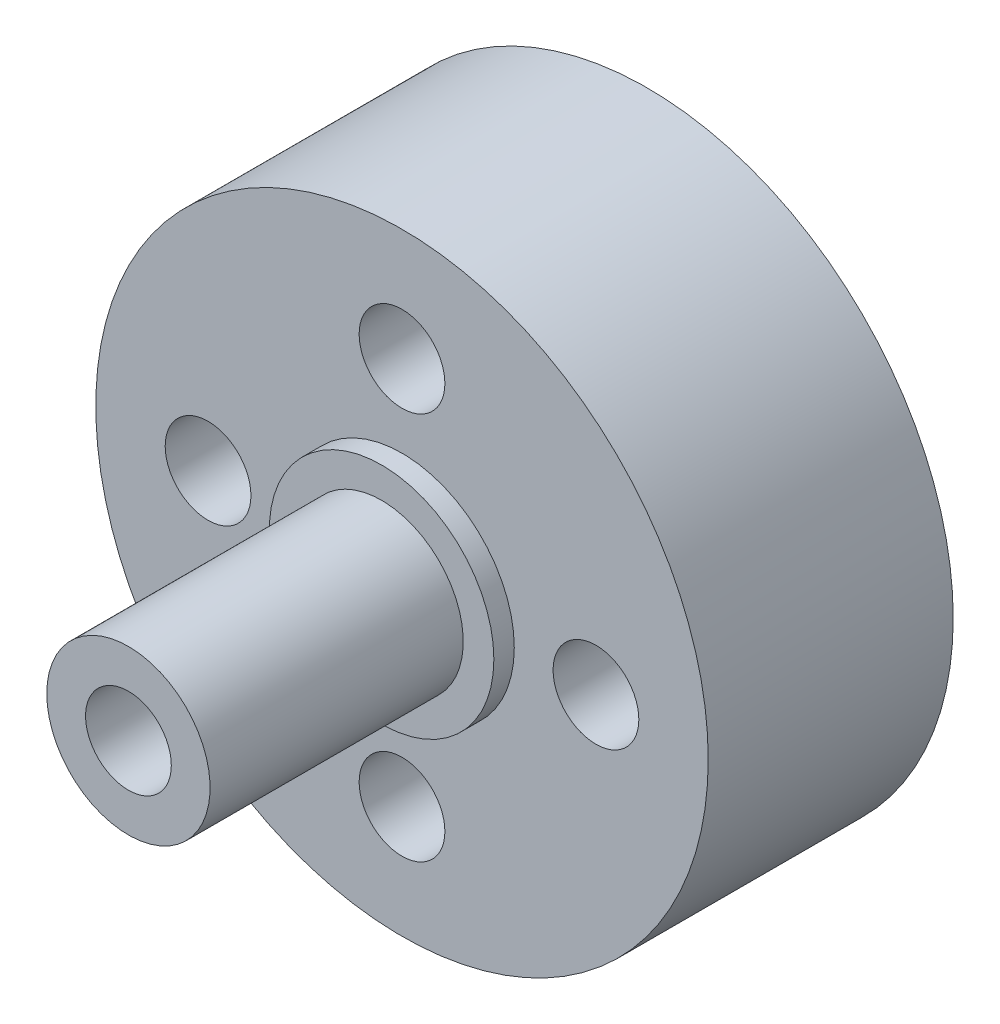
ISO-10303-21;
HEADER;
FILE_DESCRIPTION(('STEP AP214'),'2;1');
FILE_NAME('part.step','',(''),(''),'','','');
FILE_SCHEMA(('AUTOMOTIVE_DESIGN { 1 0 10303 214 1 1 1 1 }'));
ENDSEC;
DATA;
#1=APPLICATION_CONTEXT('core data for automotive mechanical design processes');
#2=APPLICATION_PROTOCOL_DEFINITION('international standard','automotive_design',2000,#1);
#3=PRODUCT_CONTEXT('',#1,'mechanical');
#4=PRODUCT('Part','Part','',(#3));
#5=PRODUCT_RELATED_PRODUCT_CATEGORY('part','',(#4));
#6=PRODUCT_DEFINITION_FORMATION('','',#4);
#7=PRODUCT_DEFINITION_CONTEXT('part definition',#1,'design');
#8=PRODUCT_DEFINITION('design','',#6,#7);
#9=PRODUCT_DEFINITION_SHAPE('','',#8);
#10=(LENGTH_UNIT() NAMED_UNIT(*) SI_UNIT(.MILLI.,.METRE.));
#11=(NAMED_UNIT(*) PLANE_ANGLE_UNIT() SI_UNIT($,.RADIAN.));
#12=(NAMED_UNIT(*) SI_UNIT($,.STERADIAN.) SOLID_ANGLE_UNIT());
#13=UNCERTAINTY_MEASURE_WITH_UNIT(LENGTH_MEASURE(1.E-05),#10,'distance_accuracy_value','');
#14=(GEOMETRIC_REPRESENTATION_CONTEXT(3) GLOBAL_UNCERTAINTY_ASSIGNED_CONTEXT((#13)) GLOBAL_UNIT_ASSIGNED_CONTEXT((#10,
#11,#12)) REPRESENTATION_CONTEXT('',''));
#15=CARTESIAN_POINT('',(0.,0.,0.));
#16=DIRECTION('',(0.,0.,1.));
#17=DIRECTION('',(1.,0.,0.));
#18=AXIS2_PLACEMENT_3D('',#15,#16,#17);
#19=CARTESIAN_POINT('',(0.,0.,13.));
#20=DIRECTION('',(0.,0.,1.));
#21=DIRECTION('',(1.,0.,0.));
#22=AXIS2_PLACEMENT_3D('',#19,#20,#21);
#23=PLANE('',#22);
#24=CARTESIAN_POINT('',(0.,0.,13.));
#25=DIRECTION('',(0.,0.,1.));
#26=DIRECTION('',(1.,0.,0.));
#27=AXIS2_PLACEMENT_3D('',#24,#25,#26);
#28=CIRCLE('',#27,5.5);
#29=CARTESIAN_POINT('',(5.5,0.,13.));
#30=VERTEX_POINT('',#29);
#31=EDGE_CURVE('E94',#30,#30,#28,.T.);
#32=ORIENTED_EDGE('',*,*,#31,.T.);
#33=EDGE_LOOP('',(#32));
#34=FACE_BOUND('',#33,.T.);
#35=CARTESIAN_POINT('',(0.,0.,13.));
#36=DIRECTION('',(0.,0.,1.));
#37=DIRECTION('',(1.,0.,0.));
#38=AXIS2_PLACEMENT_3D('',#35,#36,#37);
#39=CIRCLE('',#38,4.);
#40=CARTESIAN_POINT('',(-4.,0.,13.));
#41=VERTEX_POINT('',#40);
#42=EDGE_CURVE('E87',#41,#41,#39,.T.);
#43=ORIENTED_EDGE('',*,*,#42,.F.);
#44=EDGE_LOOP('',(#43));
#45=FACE_BOUND('',#44,.T.);
#46=ADVANCED_FACE('F38',(#34,#45),#23,.T.);
#47=CARTESIAN_POINT('',(0.,0.,12.));
#48=DIRECTION('',(0.,0.,1.));
#49=DIRECTION('',(1.,0.,0.));
#50=AXIS2_PLACEMENT_3D('',#47,#48,#49);
#51=PLANE('',#50);
#52=CARTESIAN_POINT('',(0.,9.5,12.));
#53=DIRECTION('',(0.,0.,1.));
#54=DIRECTION('',(1.,0.,0.));
#55=AXIS2_PLACEMENT_3D('',#52,#53,#54);
#56=CIRCLE('',#55,2.09999999999999);
#57=CARTESIAN_POINT('',(2.09999999999999,9.5,12.));
#58=VERTEX_POINT('',#57);
#59=EDGE_CURVE('E62',#58,#58,#56,.T.);
#60=ORIENTED_EDGE('',*,*,#59,.F.);
#61=EDGE_LOOP('',(#60));
#62=FACE_BOUND('',#61,.T.);
#63=CARTESIAN_POINT('',(-9.5,0.,12.));
#64=DIRECTION('',(0.,0.,1.));
#65=DIRECTION('',(1.,0.,0.));
#66=AXIS2_PLACEMENT_3D('',#63,#64,#65);
#67=CIRCLE('',#66,2.09999999999999);
#68=CARTESIAN_POINT('',(-7.40000000000001,0.,12.));
#69=VERTEX_POINT('',#68);
#70=EDGE_CURVE('E72',#69,#69,#67,.T.);
#71=ORIENTED_EDGE('',*,*,#70,.F.);
#72=EDGE_LOOP('',(#71));
#73=FACE_BOUND('',#72,.T.);
#74=CARTESIAN_POINT('',(9.5,0.,12.));
#75=DIRECTION('',(0.,0.,1.));
#76=DIRECTION('',(1.,0.,0.));
#77=AXIS2_PLACEMENT_3D('',#74,#75,#76);
#78=CIRCLE('',#77,2.09999999999999);
#79=CARTESIAN_POINT('',(11.6,0.,12.));
#80=VERTEX_POINT('',#79);
#81=EDGE_CURVE('E78',#80,#80,#78,.T.);
#82=ORIENTED_EDGE('',*,*,#81,.F.);
#83=EDGE_LOOP('',(#82));
#84=FACE_BOUND('',#83,.T.);
#85=CARTESIAN_POINT('',(0.,-9.5,12.));
#86=DIRECTION('',(0.,0.,1.));
#87=DIRECTION('',(1.,0.,0.));
#88=AXIS2_PLACEMENT_3D('',#85,#86,#87);
#89=CIRCLE('',#88,2.09999999999999);
#90=CARTESIAN_POINT('',(2.09999999999999,-9.5,12.));
#91=VERTEX_POINT('',#90);
#92=EDGE_CURVE('E84',#91,#91,#89,.T.);
#93=ORIENTED_EDGE('',*,*,#92,.F.);
#94=EDGE_LOOP('',(#93));
#95=FACE_BOUND('',#94,.T.);
#96=CARTESIAN_POINT('',(0.,0.,12.));
#97=DIRECTION('',(0.,0.,1.));
#98=DIRECTION('',(1.,0.,0.));
#99=AXIS2_PLACEMENT_3D('',#96,#97,#98);
#100=CIRCLE('',#99,15.);
#101=CARTESIAN_POINT('',(15.,0.,12.));
#102=VERTEX_POINT('',#101);
#103=EDGE_CURVE('E11',#102,#102,#100,.T.);
#104=ORIENTED_EDGE('',*,*,#103,.T.);
#105=EDGE_LOOP('',(#104));
#106=FACE_BOUND('',#105,.T.);
#107=CARTESIAN_POINT('',(0.,0.,12.));
#108=DIRECTION('',(0.,0.,1.));
#109=DIRECTION('',(1.,0.,0.));
#110=AXIS2_PLACEMENT_3D('',#107,#108,#109);
#111=CIRCLE('',#110,5.5);
#112=CARTESIAN_POINT('',(5.5,0.,12.));
#113=VERTEX_POINT('',#112);
#114=EDGE_CURVE('E91',#113,#113,#111,.T.);
#115=ORIENTED_EDGE('',*,*,#114,.F.);
#116=EDGE_LOOP('',(#115));
#117=FACE_BOUND('',#116,.T.);
#118=ADVANCED_FACE('F102',(#62,#73,#84,#95,#106,#117),#51,.T.);
#119=CARTESIAN_POINT('',(0.,0.,12.));
#120=DIRECTION('',(0.,0.,-1.));
#121=DIRECTION('',(-1.,0.,0.));
#122=AXIS2_PLACEMENT_3D('',#119,#120,#121);
#123=CYLINDRICAL_SURFACE('',#122,15.);
#124=ORIENTED_EDGE('',*,*,#103,.F.);
#125=EDGE_LOOP('',(#124));
#126=FACE_BOUND('',#125,.T.);
#127=CARTESIAN_POINT('',(0.,0.,0.));
#128=DIRECTION('',(0.,0.,1.));
#129=DIRECTION('',(1.,0.,0.));
#130=AXIS2_PLACEMENT_3D('',#127,#128,#129);
#131=CIRCLE('',#130,15.);
#132=CARTESIAN_POINT('',(15.,0.,0.));
#133=VERTEX_POINT('',#132);
#134=EDGE_CURVE('E42',#133,#133,#131,.T.);
#135=ORIENTED_EDGE('',*,*,#134,.T.);
#136=EDGE_LOOP('',(#135));
#137=FACE_BOUND('',#136,.T.);
#138=ADVANCED_FACE('F40',(#126,#137),#123,.T.);
#139=CARTESIAN_POINT('',(0.,0.,0.));
#140=DIRECTION('',(0.,0.,1.));
#141=DIRECTION('',(1.,0.,0.));
#142=AXIS2_PLACEMENT_3D('',#139,#140,#141);
#143=PLANE('',#142);
#144=CARTESIAN_POINT('',(0.,9.5,0.));
#145=DIRECTION('',(0.,0.,-1.));
#146=DIRECTION('',(-1.,0.,0.));
#147=AXIS2_PLACEMENT_3D('',#144,#145,#146);
#148=CIRCLE('',#147,2.09999999999999);
#149=CARTESIAN_POINT('',(-2.09999999999999,9.5,0.));
#150=VERTEX_POINT('',#149);
#151=EDGE_CURVE('E58',#150,#150,#148,.T.);
#152=ORIENTED_EDGE('',*,*,#151,.F.);
#153=EDGE_LOOP('',(#152));
#154=FACE_BOUND('',#153,.T.);
#155=CARTESIAN_POINT('',(-9.5,0.,0.));
#156=DIRECTION('',(0.,0.,-1.));
#157=DIRECTION('',(-1.,0.,0.));
#158=AXIS2_PLACEMENT_3D('',#155,#156,#157);
#159=CIRCLE('',#158,2.09999999999999);
#160=CARTESIAN_POINT('',(-11.6,0.,0.));
#161=VERTEX_POINT('',#160);
#162=EDGE_CURVE('E69',#161,#161,#159,.T.);
#163=ORIENTED_EDGE('',*,*,#162,.F.);
#164=EDGE_LOOP('',(#163));
#165=FACE_BOUND('',#164,.T.);
#166=CARTESIAN_POINT('',(9.5,0.,0.));
#167=DIRECTION('',(0.,0.,-1.));
#168=DIRECTION('',(-1.,0.,0.));
#169=AXIS2_PLACEMENT_3D('',#166,#167,#168);
#170=CIRCLE('',#169,2.09999999999999);
#171=CARTESIAN_POINT('',(7.40000000000001,0.,0.));
#172=VERTEX_POINT('',#171);
#173=EDGE_CURVE('E75',#172,#172,#170,.T.);
#174=ORIENTED_EDGE('',*,*,#173,.F.);
#175=EDGE_LOOP('',(#174));
#176=FACE_BOUND('',#175,.T.);
#177=CARTESIAN_POINT('',(0.,-9.5,0.));
#178=DIRECTION('',(0.,0.,-1.));
#179=DIRECTION('',(-1.,0.,0.));
#180=AXIS2_PLACEMENT_3D('',#177,#178,#179);
#181=CIRCLE('',#180,2.09999999999999);
#182=CARTESIAN_POINT('',(-2.09999999999999,-9.5,0.));
#183=VERTEX_POINT('',#182);
#184=EDGE_CURVE('E81',#183,#183,#181,.T.);
#185=ORIENTED_EDGE('',*,*,#184,.F.);
#186=EDGE_LOOP('',(#185));
#187=FACE_BOUND('',#186,.T.);
#188=ORIENTED_EDGE('',*,*,#134,.F.);
#189=EDGE_LOOP('',(#188));
#190=FACE_BOUND('',#189,.T.);
#191=ADVANCED_FACE('F110',(#154,#165,#176,#187,#190),#143,.F.);
#192=CARTESIAN_POINT('',(0.,0.,13.));
#193=DIRECTION('',(0.,0.,-1.));
#194=DIRECTION('',(-1.,0.,0.));
#195=AXIS2_PLACEMENT_3D('',#192,#193,#194);
#196=CYLINDRICAL_SURFACE('',#195,5.5);
#197=ORIENTED_EDGE('',*,*,#31,.F.);
#198=EDGE_LOOP('',(#197));
#199=FACE_BOUND('',#198,.T.);
#200=ORIENTED_EDGE('',*,*,#114,.T.);
#201=EDGE_LOOP('',(#200));
#202=FACE_BOUND('',#201,.T.);
#203=ADVANCED_FACE('F100',(#199,#202),#196,.T.);
#204=CARTESIAN_POINT('',(0.,0.,25.4));
#205=DIRECTION('',(0.,0.,-1.));
#206=DIRECTION('',(-1.,0.,0.));
#207=AXIS2_PLACEMENT_3D('',#204,#205,#206);
#208=CYLINDRICAL_SURFACE('',#207,4.);
#209=CARTESIAN_POINT('',(0.,0.,25.4));
#210=DIRECTION('',(0.,0.,1.));
#211=DIRECTION('',(1.,0.,0.));
#212=AXIS2_PLACEMENT_3D('',#209,#210,#211);
#213=CIRCLE('',#212,4.);
#214=CARTESIAN_POINT('',(-4.,0.,25.4));
#215=VERTEX_POINT('',#214);
#216=EDGE_CURVE('E88',#215,#215,#213,.T.);
#217=CARTESIAN_POINT('',(-4.,0.,25.4));
#218=CARTESIAN_POINT('',(-4.,0.,25.2708333333333));
#219=CARTESIAN_POINT('',(-4.,0.,25.1416666666667));
#220=CARTESIAN_POINT('',(-4.,0.,24.8833333333333));
#221=CARTESIAN_POINT('',(-4.,0.,24.7541666666667));
#222=CARTESIAN_POINT('',(-4.,0.,24.4958333333333));
#223=CARTESIAN_POINT('',(-4.,0.,24.3666666666667));
#224=CARTESIAN_POINT('',(-4.,0.,24.1083333333333));
#225=CARTESIAN_POINT('',(-4.,0.,23.9791666666667));
#226=CARTESIAN_POINT('',(-4.,0.,23.7208333333333));
#227=CARTESIAN_POINT('',(-4.,0.,23.5916666666667));
#228=CARTESIAN_POINT('',(-4.,0.,23.3333333333333));
#229=CARTESIAN_POINT('',(-4.,0.,23.2041666666667));
#230=CARTESIAN_POINT('',(-4.,0.,22.9458333333333));
#231=CARTESIAN_POINT('',(-4.,0.,22.8166666666667));
#232=CARTESIAN_POINT('',(-4.,0.,22.5583333333333));
#233=CARTESIAN_POINT('',(-4.,0.,22.4291666666667));
#234=CARTESIAN_POINT('',(-4.,0.,22.1708333333333));
#235=CARTESIAN_POINT('',(-4.,0.,22.0416666666667));
#236=CARTESIAN_POINT('',(-4.,0.,21.7833333333333));
#237=CARTESIAN_POINT('',(-4.,0.,21.6541666666667));
#238=CARTESIAN_POINT('',(-4.,0.,21.3958333333333));
#239=CARTESIAN_POINT('',(-4.,0.,21.2666666666667));
#240=CARTESIAN_POINT('',(-4.,0.,21.0083333333333));
#241=CARTESIAN_POINT('',(-4.,0.,20.8791666666667));
#242=CARTESIAN_POINT('',(-4.,0.,20.6208333333333));
#243=CARTESIAN_POINT('',(-4.,0.,20.4916666666667));
#244=CARTESIAN_POINT('',(-4.,0.,20.2333333333333));
#245=CARTESIAN_POINT('',(-4.,0.,20.1041666666667));
#246=CARTESIAN_POINT('',(-4.,0.,19.8458333333333));
#247=CARTESIAN_POINT('',(-4.,0.,19.7166666666667));
#248=CARTESIAN_POINT('',(-4.,0.,19.4583333333333));
#249=CARTESIAN_POINT('',(-4.,0.,19.3291666666667));
#250=CARTESIAN_POINT('',(-4.,0.,19.0708333333333));
#251=CARTESIAN_POINT('',(-4.,0.,18.9416666666667));
#252=CARTESIAN_POINT('',(-4.,0.,18.6833333333333));
#253=CARTESIAN_POINT('',(-4.,0.,18.5541666666667));
#254=CARTESIAN_POINT('',(-4.,0.,18.2958333333333));
#255=CARTESIAN_POINT('',(-4.,0.,18.1666666666667));
#256=CARTESIAN_POINT('',(-4.,0.,17.9083333333333));
#257=CARTESIAN_POINT('',(-4.,0.,17.7791666666667));
#258=CARTESIAN_POINT('',(-4.,0.,17.5208333333333));
#259=CARTESIAN_POINT('',(-4.,0.,17.3916666666667));
#260=CARTESIAN_POINT('',(-4.,0.,17.1333333333333));
#261=CARTESIAN_POINT('',(-4.,0.,17.0041666666667));
#262=CARTESIAN_POINT('',(-4.,0.,16.7458333333333));
#263=CARTESIAN_POINT('',(-4.,0.,16.6166666666667));
#264=CARTESIAN_POINT('',(-4.,0.,16.3583333333333));
#265=CARTESIAN_POINT('',(-4.,0.,16.2291666666667));
#266=CARTESIAN_POINT('',(-4.,0.,15.9708333333333));
#267=CARTESIAN_POINT('',(-4.,0.,15.8416666666667));
#268=CARTESIAN_POINT('',(-4.,0.,15.5833333333333));
#269=CARTESIAN_POINT('',(-4.,0.,15.4541666666667));
#270=CARTESIAN_POINT('',(-4.,0.,15.1958333333333));
#271=CARTESIAN_POINT('',(-4.,0.,15.0666666666667));
#272=CARTESIAN_POINT('',(-4.,0.,14.8083333333333));
#273=CARTESIAN_POINT('',(-4.,0.,14.6791666666667));
#274=CARTESIAN_POINT('',(-4.,0.,14.4208333333333));
#275=CARTESIAN_POINT('',(-4.,0.,14.2916666666667));
#276=CARTESIAN_POINT('',(-4.,0.,14.0333333333333));
#277=CARTESIAN_POINT('',(-4.,0.,13.9041666666667));
#278=CARTESIAN_POINT('',(-4.,0.,13.6458333333333));
#279=CARTESIAN_POINT('',(-4.,0.,13.5166666666667));
#280=CARTESIAN_POINT('',(-4.,0.,13.2583333333333));
#281=CARTESIAN_POINT('',(-4.,0.,13.1291666666667));
#282=CARTESIAN_POINT('',(-4.,0.,13.));
#283=B_SPLINE_CURVE_WITH_KNOTS('',3,(#217,#218,#219,#220,#221,#222,#223,#224,#225,#226,#227,
#228,#229,#230,#231,#232,#233,#234,#235,#236,#237,#238,#239,#240,#241,#242,#243,#244,#245,#246,
#247,#248,#249,#250,#251,#252,#253,#254,#255,#256,#257,#258,#259,#260,#261,#262,#263,#264,#265,
#266,#267,#268,#269,#270,#271,#272,#273,#274,#275,#276,#277,#278,#279,#280,#281,#282),
.UNSPECIFIED.,.F.,.F.,(4,2,2,2,2,2,2,2,2,2,2,2,2,2,2,2,2,2,2,2,2,2,2,2,2,2,2,2,2,2,2,2,4),(0.,
0.387500000000002,0.775000000000001,1.1625,1.55,1.9375,2.325,2.7125,3.1,3.4875,3.875,4.2625,
4.65,5.0375,5.425,5.8125,6.2,6.5875,6.975,7.3625,7.75,8.1375,8.525,8.9125,9.3,9.6875,10.075,
10.4625,10.85,11.2375,11.625,12.0125,12.4),.UNSPECIFIED.);
#284=EDGE_CURVE('BSEAM122',#215,#41,#283,.T.);
#285=ORIENTED_EDGE('',*,*,#216,.F.);
#286=ORIENTED_EDGE('',*,*,#42,.T.);
#287=ORIENTED_EDGE('',*,*,#284,.T.);
#288=ORIENTED_EDGE('',*,*,#284,.F.);
#289=EDGE_LOOP('',(#285,#287,#286,#288));
#290=FACE_BOUND('',#289,.T.);
#291=ADVANCED_FACE('F122',(#290),#208,.T.);
#292=CARTESIAN_POINT('',(0.,0.,25.4));
#293=DIRECTION('',(0.,0.,1.));
#294=DIRECTION('',(1.,0.,0.));
#295=AXIS2_PLACEMENT_3D('',#292,#293,#294);
#296=PLANE('',#295);
#297=CARTESIAN_POINT('',(0.,0.,25.4));
#298=DIRECTION('',(0.,0.,1.));
#299=DIRECTION('',(1.,0.,0.));
#300=AXIS2_PLACEMENT_3D('',#297,#298,#299);
#301=CIRCLE('',#300,2.09999999999999);
#302=CARTESIAN_POINT('',(2.09999999999999,0.,25.4));
#303=VERTEX_POINT('',#302);
#304=EDGE_CURVE('E59',#303,#303,#301,.T.);
#305=ORIENTED_EDGE('',*,*,#304,.F.);
#306=EDGE_LOOP('',(#305));
#307=FACE_BOUND('',#306,.T.);
#308=ORIENTED_EDGE('',*,*,#216,.T.);
#309=EDGE_LOOP('',(#308));
#310=FACE_BOUND('',#309,.T.);
#311=ADVANCED_FACE('F139',(#307,#310),#296,.T.);
#312=CARTESIAN_POINT('',(0.,-9.5,0.));
#313=DIRECTION('',(0.,0.,-1.));
#314=DIRECTION('',(-1.,0.,0.));
#315=AXIS2_PLACEMENT_3D('',#312,#313,#314);
#316=CYLINDRICAL_SURFACE('',#315,2.09999999999999);
#317=ORIENTED_EDGE('',*,*,#92,.T.);
#318=EDGE_LOOP('',(#317));
#319=FACE_BOUND('',#318,.T.);
#320=ORIENTED_EDGE('',*,*,#184,.T.);
#321=EDGE_LOOP('',(#320));
#322=FACE_BOUND('',#321,.T.);
#323=ADVANCED_FACE('F136',(#319,#322),#316,.F.);
#324=CARTESIAN_POINT('',(9.5,0.,0.));
#325=DIRECTION('',(0.,0.,-1.));
#326=DIRECTION('',(-1.,0.,0.));
#327=AXIS2_PLACEMENT_3D('',#324,#325,#326);
#328=CYLINDRICAL_SURFACE('',#327,2.09999999999999);
#329=ORIENTED_EDGE('',*,*,#81,.T.);
#330=EDGE_LOOP('',(#329));
#331=FACE_BOUND('',#330,.T.);
#332=ORIENTED_EDGE('',*,*,#173,.T.);
#333=EDGE_LOOP('',(#332));
#334=FACE_BOUND('',#333,.T.);
#335=ADVANCED_FACE('F138',(#331,#334),#328,.F.);
#336=CARTESIAN_POINT('',(-9.5,0.,0.));
#337=DIRECTION('',(0.,0.,-1.));
#338=DIRECTION('',(-1.,0.,0.));
#339=AXIS2_PLACEMENT_3D('',#336,#337,#338);
#340=CYLINDRICAL_SURFACE('',#339,2.09999999999999);
#341=ORIENTED_EDGE('',*,*,#70,.T.);
#342=EDGE_LOOP('',(#341));
#343=FACE_BOUND('',#342,.T.);
#344=ORIENTED_EDGE('',*,*,#162,.T.);
#345=EDGE_LOOP('',(#344));
#346=FACE_BOUND('',#345,.T.);
#347=ADVANCED_FACE('F146',(#343,#346),#340,.F.);
#348=CARTESIAN_POINT('',(0.,9.5,0.));
#349=DIRECTION('',(0.,0.,-1.));
#350=DIRECTION('',(-1.,0.,0.));
#351=AXIS2_PLACEMENT_3D('',#348,#349,#350);
#352=CYLINDRICAL_SURFACE('',#351,2.09999999999999);
#353=ORIENTED_EDGE('',*,*,#59,.T.);
#354=EDGE_LOOP('',(#353));
#355=FACE_BOUND('',#354,.T.);
#356=ORIENTED_EDGE('',*,*,#151,.T.);
#357=EDGE_LOOP('',(#356));
#358=FACE_BOUND('',#357,.T.);
#359=ADVANCED_FACE('F52',(#355,#358),#352,.F.);
#360=CARTESIAN_POINT('',(0.,0.,11.4));
#361=DIRECTION('',(0.,0.,1.));
#362=DIRECTION('',(1.,0.,0.));
#363=AXIS2_PLACEMENT_3D('',#360,#361,#362);
#364=CONICAL_SURFACE('',#363,2.09999999999999,1.02974425867665);
#365=CARTESIAN_POINT('',(0.,0.,10.1381927000421));
#366=VERTEX_POINT('',#365);
#367=VERTEX_LOOP('',#366);
#368=FACE_BOUND('',#367,.T.);
#369=CARTESIAN_POINT('',(0.,0.,11.4));
#370=DIRECTION('',(0.,0.,1.));
#371=DIRECTION('',(1.,0.,0.));
#372=AXIS2_PLACEMENT_3D('',#369,#370,#371);
#373=CIRCLE('',#372,2.09999999999999);
#374=CARTESIAN_POINT('',(2.09999999999999,0.,11.4));
#375=VERTEX_POINT('',#374);
#376=EDGE_CURVE('E56',#375,#375,#373,.T.);
#377=ORIENTED_EDGE('',*,*,#376,.T.);
#378=EDGE_LOOP('',(#377));
#379=FACE_BOUND('',#378,.T.);
#380=ADVANCED_FACE('F48',(#368,#379),#364,.F.);
#381=CARTESIAN_POINT('',(0.,0.,25.4));
#382=DIRECTION('',(0.,0.,1.));
#383=DIRECTION('',(1.,0.,0.));
#384=AXIS2_PLACEMENT_3D('',#381,#382,#383);
#385=CYLINDRICAL_SURFACE('',#384,2.09999999999999);
#386=ORIENTED_EDGE('',*,*,#376,.F.);
#387=EDGE_LOOP('',(#386));
#388=FACE_BOUND('',#387,.T.);
#389=ORIENTED_EDGE('',*,*,#304,.T.);
#390=EDGE_LOOP('',(#389));
#391=FACE_BOUND('',#390,.T.);
#392=ADVANCED_FACE('F51',(#388,#391),#385,.F.);
#393=CLOSED_SHELL('',(#46,#118,#138,#191,#203,#291,#311,#323,#335,#347,#359,#380,#392));
#394=MANIFOLD_SOLID_BREP('B2',#393);
#395=ADVANCED_BREP_SHAPE_REPRESENTATION('',(#18,#394),#14);
#396=SHAPE_DEFINITION_REPRESENTATION(#9,#395);
ENDSEC;
END-ISO-10303-21;
